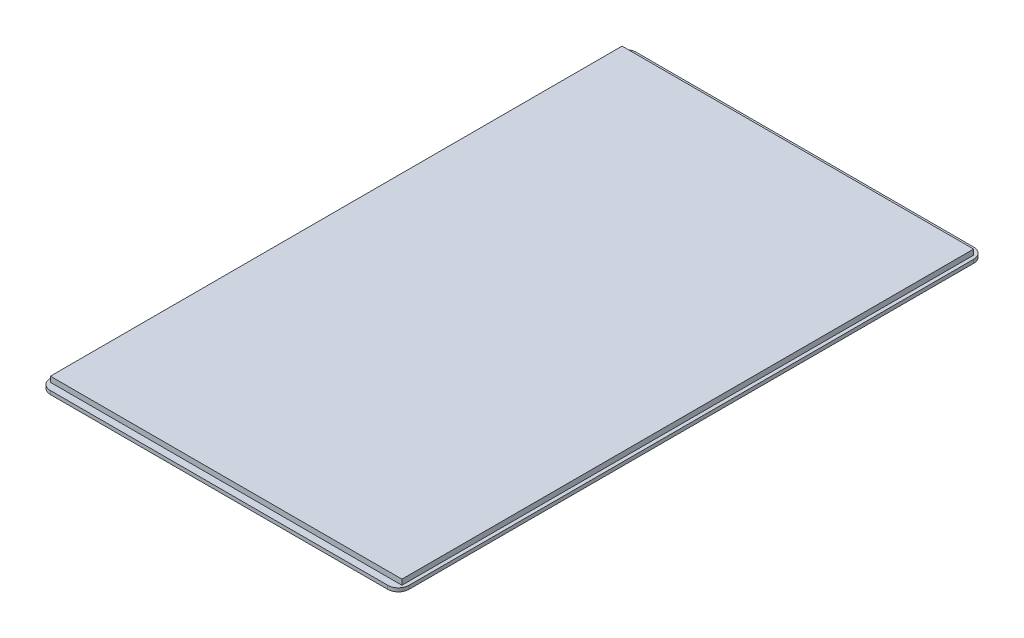
ISO-10303-21;
HEADER;
FILE_DESCRIPTION(('STEP AP214'),'2;1');
FILE_NAME('part.step','',(''),(''),'','','');
FILE_SCHEMA(('AUTOMOTIVE_DESIGN { 1 0 10303 214 1 1 1 1 }'));
ENDSEC;
DATA;
#1=APPLICATION_CONTEXT('core data for automotive mechanical design processes');
#2=APPLICATION_PROTOCOL_DEFINITION('international standard','automotive_design',2000,#1);
#3=PRODUCT_CONTEXT('',#1,'mechanical');
#4=PRODUCT('Part','Part','',(#3));
#5=PRODUCT_RELATED_PRODUCT_CATEGORY('part','',(#4));
#6=PRODUCT_DEFINITION_FORMATION('','',#4);
#7=PRODUCT_DEFINITION_CONTEXT('part definition',#1,'design');
#8=PRODUCT_DEFINITION('design','',#6,#7);
#9=PRODUCT_DEFINITION_SHAPE('','',#8);
#10=(LENGTH_UNIT() NAMED_UNIT(*) SI_UNIT(.MILLI.,.METRE.));
#11=(NAMED_UNIT(*) PLANE_ANGLE_UNIT() SI_UNIT($,.RADIAN.));
#12=(NAMED_UNIT(*) SI_UNIT($,.STERADIAN.) SOLID_ANGLE_UNIT());
#13=UNCERTAINTY_MEASURE_WITH_UNIT(LENGTH_MEASURE(1.E-05),#10,'distance_accuracy_value','');
#14=(GEOMETRIC_REPRESENTATION_CONTEXT(3) GLOBAL_UNCERTAINTY_ASSIGNED_CONTEXT((#13)) GLOBAL_UNIT_ASSIGNED_CONTEXT((#10,
#11,#12)) REPRESENTATION_CONTEXT('',''));
#15=CARTESIAN_POINT('',(0.,0.,0.));
#16=DIRECTION('',(0.,0.,1.));
#17=DIRECTION('',(1.,0.,0.));
#18=AXIS2_PLACEMENT_3D('',#15,#16,#17);
#19=CARTESIAN_POINT('',(50.5,1.,-82.5));
#20=DIRECTION('',(-1.,0.,0.));
#21=DIRECTION('',(0.,0.,1.));
#22=AXIS2_PLACEMENT_3D('',#19,#20,#21);
#23=PLANE('',#22);
#24=DIRECTION('',(0.,0.,-1.));
#25=VECTOR('',#24,1.);
#26=CARTESIAN_POINT('',(50.5,1.,-82.5));
#27=LINE('',#26,#25);
#28=CARTESIAN_POINT('',(50.5,1.,79.5));
#29=VERTEX_POINT('',#28);
#30=CARTESIAN_POINT('',(50.5,1.,-79.5));
#31=VERTEX_POINT('',#30);
#32=EDGE_CURVE('E157',#29,#31,#27,.T.);
#33=ORIENTED_EDGE('',*,*,#32,.F.);
#34=DIRECTION('',(0.,-1.,0.));
#35=VECTOR('',#34,1.);
#36=CARTESIAN_POINT('',(50.5,1.,79.5));
#37=LINE('',#36,#35);
#38=CARTESIAN_POINT('',(50.5,0.,79.5));
#39=VERTEX_POINT('',#38);
#40=EDGE_CURVE('E201',#29,#39,#37,.T.);
#41=ORIENTED_EDGE('',*,*,#40,.T.);
#42=DIRECTION('',(0.,0.,-1.));
#43=VECTOR('',#42,1.);
#44=CARTESIAN_POINT('',(50.5,0.,-82.5));
#45=LINE('',#44,#43);
#46=CARTESIAN_POINT('',(50.5,0.,-79.5));
#47=VERTEX_POINT('',#46);
#48=EDGE_CURVE('E148',#39,#47,#45,.T.);
#49=ORIENTED_EDGE('',*,*,#48,.T.);
#50=DIRECTION('',(0.,-1.,0.));
#51=VECTOR('',#50,1.);
#52=CARTESIAN_POINT('',(50.5,1.,-79.5));
#53=LINE('',#52,#51);
#54=EDGE_CURVE('E199',#47,#31,#53,.F.);
#55=ORIENTED_EDGE('',*,*,#54,.T.);
#56=EDGE_LOOP('',(#33,#41,#49,#55));
#57=FACE_BOUND('',#56,.T.);
#58=ADVANCED_FACE('F33',(#57),#23,.F.);
#59=CARTESIAN_POINT('',(-50.5,1.,-82.5));
#60=DIRECTION('',(0.,0.,1.));
#61=DIRECTION('',(1.,0.,0.));
#62=AXIS2_PLACEMENT_3D('',#59,#60,#61);
#63=PLANE('',#62);
#64=DIRECTION('',(-1.,0.,0.));
#65=VECTOR('',#64,1.);
#66=CARTESIAN_POINT('',(-50.5,1.,-82.5));
#67=LINE('',#66,#65);
#68=CARTESIAN_POINT('',(47.5,1.,-82.5));
#69=VERTEX_POINT('',#68);
#70=CARTESIAN_POINT('',(-47.5,1.,-82.5));
#71=VERTEX_POINT('',#70);
#72=EDGE_CURVE('E159',#69,#71,#67,.T.);
#73=ORIENTED_EDGE('',*,*,#72,.F.);
#74=DIRECTION('',(0.,-1.,0.));
#75=VECTOR('',#74,1.);
#76=CARTESIAN_POINT('',(47.5,1.,-82.5));
#77=LINE('',#76,#75);
#78=CARTESIAN_POINT('',(47.5,0.,-82.5));
#79=VERTEX_POINT('',#78);
#80=EDGE_CURVE('E11',#69,#79,#77,.T.);
#81=ORIENTED_EDGE('',*,*,#80,.T.);
#82=DIRECTION('',(-1.,0.,0.));
#83=VECTOR('',#82,1.);
#84=CARTESIAN_POINT('',(-50.5,0.,-82.5));
#85=LINE('',#84,#83);
#86=CARTESIAN_POINT('',(-47.5,0.,-82.5));
#87=VERTEX_POINT('',#86);
#88=EDGE_CURVE('E151',#79,#87,#85,.T.);
#89=ORIENTED_EDGE('',*,*,#88,.T.);
#90=DIRECTION('',(0.,-1.,0.));
#91=VECTOR('',#90,1.);
#92=CARTESIAN_POINT('',(-47.5,1.,-82.5));
#93=LINE('',#92,#91);
#94=EDGE_CURVE('E41',#87,#71,#93,.F.);
#95=ORIENTED_EDGE('',*,*,#94,.T.);
#96=EDGE_LOOP('',(#73,#81,#89,#95));
#97=FACE_BOUND('',#96,.T.);
#98=ADVANCED_FACE('F217',(#97),#63,.F.);
#99=CARTESIAN_POINT('',(-50.5,1.,-82.5));
#100=DIRECTION('',(1.,0.,0.));
#101=DIRECTION('',(0.,0.,-1.));
#102=AXIS2_PLACEMENT_3D('',#99,#100,#101);
#103=PLANE('',#102);
#104=DIRECTION('',(0.,0.,1.));
#105=VECTOR('',#104,1.);
#106=CARTESIAN_POINT('',(-50.5,0.,-82.5));
#107=LINE('',#106,#105);
#108=CARTESIAN_POINT('',(-50.5,0.,-79.5));
#109=VERTEX_POINT('',#108);
#110=CARTESIAN_POINT('',(-50.5,0.,79.5));
#111=VERTEX_POINT('',#110);
#112=EDGE_CURVE('E170',#109,#111,#107,.T.);
#113=ORIENTED_EDGE('',*,*,#112,.T.);
#114=DIRECTION('',(0.,-1.,0.));
#115=VECTOR('',#114,1.);
#116=CARTESIAN_POINT('',(-50.5,1.,79.5));
#117=LINE('',#116,#115);
#118=CARTESIAN_POINT('',(-50.5,1.,79.5));
#119=VERTEX_POINT('',#118);
#120=EDGE_CURVE('E190',#111,#119,#117,.F.);
#121=ORIENTED_EDGE('',*,*,#120,.T.);
#122=DIRECTION('',(0.,0.,1.));
#123=VECTOR('',#122,1.);
#124=CARTESIAN_POINT('',(-50.5,1.,-82.5));
#125=LINE('',#124,#123);
#126=CARTESIAN_POINT('',(-50.5,1.,-79.5));
#127=VERTEX_POINT('',#126);
#128=EDGE_CURVE('E162',#127,#119,#125,.T.);
#129=ORIENTED_EDGE('',*,*,#128,.F.);
#130=DIRECTION('',(0.,-1.,0.));
#131=VECTOR('',#130,1.);
#132=CARTESIAN_POINT('',(-50.5,1.,-79.5));
#133=LINE('',#132,#131);
#134=EDGE_CURVE('E187',#127,#109,#133,.T.);
#135=ORIENTED_EDGE('',*,*,#134,.T.);
#136=EDGE_LOOP('',(#113,#121,#129,#135));
#137=FACE_BOUND('',#136,.T.);
#138=ADVANCED_FACE('F225',(#137),#103,.F.);
#139=CARTESIAN_POINT('',(-50.5,1.,82.5));
#140=DIRECTION('',(0.,0.,-1.));
#141=DIRECTION('',(-1.,0.,0.));
#142=AXIS2_PLACEMENT_3D('',#139,#140,#141);
#143=PLANE('',#142);
#144=DIRECTION('',(1.,0.,0.));
#145=VECTOR('',#144,1.);
#146=CARTESIAN_POINT('',(-50.5,1.,82.5));
#147=LINE('',#146,#145);
#148=CARTESIAN_POINT('',(-47.5,1.,82.5));
#149=VERTEX_POINT('',#148);
#150=CARTESIAN_POINT('',(47.5,1.,82.5));
#151=VERTEX_POINT('',#150);
#152=EDGE_CURVE('E165',#149,#151,#147,.T.);
#153=ORIENTED_EDGE('',*,*,#152,.F.);
#154=DIRECTION('',(0.,-1.,0.));
#155=VECTOR('',#154,1.);
#156=CARTESIAN_POINT('',(-47.5,1.,82.5));
#157=LINE('',#156,#155);
#158=CARTESIAN_POINT('',(-47.5,0.,82.5));
#159=VERTEX_POINT('',#158);
#160=EDGE_CURVE('E176',#149,#159,#157,.T.);
#161=ORIENTED_EDGE('',*,*,#160,.T.);
#162=DIRECTION('',(1.,0.,0.));
#163=VECTOR('',#162,1.);
#164=CARTESIAN_POINT('',(-50.5,0.,82.5));
#165=LINE('',#164,#163);
#166=CARTESIAN_POINT('',(47.5,0.,82.5));
#167=VERTEX_POINT('',#166);
#168=EDGE_CURVE('E160',#159,#167,#165,.T.);
#169=ORIENTED_EDGE('',*,*,#168,.T.);
#170=DIRECTION('',(0.,-1.,0.));
#171=VECTOR('',#170,1.);
#172=CARTESIAN_POINT('',(47.5,1.,82.5));
#173=LINE('',#172,#171);
#174=EDGE_CURVE('E167',#167,#151,#173,.F.);
#175=ORIENTED_EDGE('',*,*,#174,.T.);
#176=EDGE_LOOP('',(#153,#161,#169,#175));
#177=FACE_BOUND('',#176,.T.);
#178=ADVANCED_FACE('F233',(#177),#143,.F.);
#179=CARTESIAN_POINT('',(0.,1.,0.));
#180=DIRECTION('',(0.,1.,0.));
#181=DIRECTION('',(0.,0.,1.));
#182=AXIS2_PLACEMENT_3D('',#179,#180,#181);
#183=PLANE('',#182);
#184=DIRECTION('',(0.,0.,-1.));
#185=VECTOR('',#184,1.);
#186=CARTESIAN_POINT('',(49.5,1.,-80.5));
#187=LINE('',#186,#185);
#188=CARTESIAN_POINT('',(49.5,1.,80.5));
#189=VERTEX_POINT('',#188);
#190=CARTESIAN_POINT('',(49.5,1.,-80.5));
#191=VERTEX_POINT('',#190);
#192=EDGE_CURVE('E147',#189,#191,#187,.T.);
#193=ORIENTED_EDGE('',*,*,#192,.F.);
#194=DIRECTION('',(1.,0.,0.));
#195=VECTOR('',#194,1.);
#196=CARTESIAN_POINT('',(-49.5,1.,80.5));
#197=LINE('',#196,#195);
#198=CARTESIAN_POINT('',(-49.5,1.,80.5));
#199=VERTEX_POINT('',#198);
#200=EDGE_CURVE('E144',#199,#189,#197,.T.);
#201=ORIENTED_EDGE('',*,*,#200,.F.);
#202=DIRECTION('',(0.,0.,1.));
#203=VECTOR('',#202,1.);
#204=CARTESIAN_POINT('',(-49.5,1.,-80.5));
#205=LINE('',#204,#203);
#206=CARTESIAN_POINT('',(-49.5,1.,-80.5));
#207=VERTEX_POINT('',#206);
#208=EDGE_CURVE('E364',#207,#199,#205,.T.);
#209=ORIENTED_EDGE('',*,*,#208,.F.);
#210=DIRECTION('',(-1.,0.,0.));
#211=VECTOR('',#210,1.);
#212=CARTESIAN_POINT('',(-49.5,1.,-80.5));
#213=LINE('',#212,#211);
#214=EDGE_CURVE('E370',#191,#207,#213,.T.);
#215=ORIENTED_EDGE('',*,*,#214,.F.);
#216=EDGE_LOOP('',(#193,#201,#209,#215));
#217=FACE_BOUND('',#216,.T.);
#218=ORIENTED_EDGE('',*,*,#128,.T.);
#219=CARTESIAN_POINT('',(-47.5,1.,79.5));
#220=DIRECTION('',(0.,1.,0.));
#221=DIRECTION('',(0.,0.,1.));
#222=AXIS2_PLACEMENT_3D('',#219,#220,#221);
#223=CIRCLE('',#222,3.);
#224=EDGE_CURVE('E197',#119,#149,#223,.T.);
#225=ORIENTED_EDGE('',*,*,#224,.T.);
#226=ORIENTED_EDGE('',*,*,#152,.T.);
#227=CARTESIAN_POINT('',(47.5,1.,79.5));
#228=DIRECTION('',(0.,1.,0.));
#229=DIRECTION('',(0.,0.,1.));
#230=AXIS2_PLACEMENT_3D('',#227,#228,#229);
#231=CIRCLE('',#230,3.);
#232=EDGE_CURVE('E195',#151,#29,#231,.T.);
#233=ORIENTED_EDGE('',*,*,#232,.T.);
#234=ORIENTED_EDGE('',*,*,#32,.T.);
#235=CARTESIAN_POINT('',(47.5,1.,-79.5));
#236=DIRECTION('',(0.,1.,0.));
#237=DIRECTION('',(0.,0.,1.));
#238=AXIS2_PLACEMENT_3D('',#235,#236,#237);
#239=CIRCLE('',#238,3.);
#240=EDGE_CURVE('E54',#31,#69,#239,.T.);
#241=ORIENTED_EDGE('',*,*,#240,.T.);
#242=ORIENTED_EDGE('',*,*,#72,.T.);
#243=CARTESIAN_POINT('',(-47.5,1.,-79.5));
#244=DIRECTION('',(0.,1.,0.));
#245=DIRECTION('',(0.,0.,1.));
#246=AXIS2_PLACEMENT_3D('',#243,#244,#245);
#247=CIRCLE('',#246,3.);
#248=EDGE_CURVE('E192',#71,#127,#247,.T.);
#249=ORIENTED_EDGE('',*,*,#248,.T.);
#250=EDGE_LOOP('',(#218,#225,#226,#233,#234,#241,#242,#249));
#251=FACE_BOUND('',#250,.T.);
#252=ADVANCED_FACE('F219',(#217,#251),#183,.T.);
#253=CARTESIAN_POINT('',(0.,0.,0.));
#254=DIRECTION('',(0.,1.,0.));
#255=DIRECTION('',(0.,0.,1.));
#256=AXIS2_PLACEMENT_3D('',#253,#254,#255);
#257=PLANE('',#256);
#258=ORIENTED_EDGE('',*,*,#168,.F.);
#259=CARTESIAN_POINT('',(-47.5,0.,79.5));
#260=DIRECTION('',(0.,1.,0.));
#261=DIRECTION('',(0.,0.,1.));
#262=AXIS2_PLACEMENT_3D('',#259,#260,#261);
#263=CIRCLE('',#262,3.);
#264=EDGE_CURVE('E185',#159,#111,#263,.F.);
#265=ORIENTED_EDGE('',*,*,#264,.T.);
#266=ORIENTED_EDGE('',*,*,#112,.F.);
#267=CARTESIAN_POINT('',(-47.5,0.,-79.5));
#268=DIRECTION('',(0.,1.,0.));
#269=DIRECTION('',(0.,0.,1.));
#270=AXIS2_PLACEMENT_3D('',#267,#268,#269);
#271=CIRCLE('',#270,3.);
#272=EDGE_CURVE('E179',#109,#87,#271,.F.);
#273=ORIENTED_EDGE('',*,*,#272,.T.);
#274=ORIENTED_EDGE('',*,*,#88,.F.);
#275=CARTESIAN_POINT('',(47.5,0.,-79.5));
#276=DIRECTION('',(0.,1.,0.));
#277=DIRECTION('',(0.,0.,1.));
#278=AXIS2_PLACEMENT_3D('',#275,#276,#277);
#279=CIRCLE('',#278,3.);
#280=EDGE_CURVE('E181',#79,#47,#279,.F.);
#281=ORIENTED_EDGE('',*,*,#280,.T.);
#282=ORIENTED_EDGE('',*,*,#48,.F.);
#283=CARTESIAN_POINT('',(47.5,0.,79.5));
#284=DIRECTION('',(0.,1.,0.));
#285=DIRECTION('',(0.,0.,1.));
#286=AXIS2_PLACEMENT_3D('',#283,#284,#285);
#287=CIRCLE('',#286,3.);
#288=EDGE_CURVE('E183',#39,#167,#287,.F.);
#289=ORIENTED_EDGE('',*,*,#288,.T.);
#290=EDGE_LOOP('',(#258,#265,#266,#273,#274,#281,#282,#289));
#291=FACE_BOUND('',#290,.T.);
#292=ADVANCED_FACE('F212',(#291),#257,.F.);
#293=CARTESIAN_POINT('',(49.5,2.5,-80.5));
#294=DIRECTION('',(-1.,0.,0.));
#295=DIRECTION('',(0.,0.,1.));
#296=AXIS2_PLACEMENT_3D('',#293,#294,#295);
#297=PLANE('',#296);
#298=ORIENTED_EDGE('',*,*,#192,.T.);
#299=DIRECTION('',(0.,-1.,0.));
#300=VECTOR('',#299,1.);
#301=CARTESIAN_POINT('',(49.5,2.5,-80.5));
#302=LINE('',#301,#300);
#303=CARTESIAN_POINT('',(49.5,2.5,-80.5));
#304=VERTEX_POINT('',#303);
#305=EDGE_CURVE('E128',#304,#191,#302,.T.);
#306=ORIENTED_EDGE('',*,*,#305,.F.);
#307=DIRECTION('',(0.,0.,-1.));
#308=VECTOR('',#307,1.);
#309=CARTESIAN_POINT('',(49.5,2.5,-80.5));
#310=LINE('',#309,#308);
#311=CARTESIAN_POINT('',(49.5,2.5,80.5));
#312=VERTEX_POINT('',#311);
#313=EDGE_CURVE('E135',#312,#304,#310,.T.);
#314=ORIENTED_EDGE('',*,*,#313,.F.);
#315=DIRECTION('',(0.,-1.,0.));
#316=VECTOR('',#315,1.);
#317=CARTESIAN_POINT('',(49.5,2.5,80.5));
#318=LINE('',#317,#316);
#319=EDGE_CURVE('E361',#312,#189,#318,.T.);
#320=ORIENTED_EDGE('',*,*,#319,.T.);
#321=EDGE_LOOP('',(#298,#306,#314,#320));
#322=FACE_BOUND('',#321,.T.);
#323=ADVANCED_FACE('F146',(#322),#297,.F.);
#324=CARTESIAN_POINT('',(-49.5,2.5,-80.5));
#325=DIRECTION('',(0.,0.,1.));
#326=DIRECTION('',(1.,0.,0.));
#327=AXIS2_PLACEMENT_3D('',#324,#325,#326);
#328=PLANE('',#327);
#329=ORIENTED_EDGE('',*,*,#214,.T.);
#330=DIRECTION('',(0.,-1.,0.));
#331=VECTOR('',#330,1.);
#332=CARTESIAN_POINT('',(-49.5,2.5,-80.5));
#333=LINE('',#332,#331);
#334=CARTESIAN_POINT('',(-49.5,2.5,-80.5));
#335=VERTEX_POINT('',#334);
#336=EDGE_CURVE('E131',#335,#207,#333,.T.);
#337=ORIENTED_EDGE('',*,*,#336,.F.);
#338=DIRECTION('',(-1.,0.,0.));
#339=VECTOR('',#338,1.);
#340=CARTESIAN_POINT('',(-49.5,2.5,-80.5));
#341=LINE('',#340,#339);
#342=EDGE_CURVE('E123',#304,#335,#341,.T.);
#343=ORIENTED_EDGE('',*,*,#342,.F.);
#344=ORIENTED_EDGE('',*,*,#305,.T.);
#345=EDGE_LOOP('',(#329,#337,#343,#344));
#346=FACE_BOUND('',#345,.T.);
#347=ADVANCED_FACE('F126',(#346),#328,.F.);
#348=CARTESIAN_POINT('',(-49.5,2.5,-80.5));
#349=DIRECTION('',(1.,0.,0.));
#350=DIRECTION('',(0.,0.,-1.));
#351=AXIS2_PLACEMENT_3D('',#348,#349,#350);
#352=PLANE('',#351);
#353=ORIENTED_EDGE('',*,*,#208,.T.);
#354=DIRECTION('',(0.,-1.,0.));
#355=VECTOR('',#354,1.);
#356=CARTESIAN_POINT('',(-49.5,2.5,80.5));
#357=LINE('',#356,#355);
#358=CARTESIAN_POINT('',(-49.5,2.5,80.5));
#359=VERTEX_POINT('',#358);
#360=EDGE_CURVE('E153',#359,#199,#357,.T.);
#361=ORIENTED_EDGE('',*,*,#360,.F.);
#362=DIRECTION('',(0.,0.,1.));
#363=VECTOR('',#362,1.);
#364=CARTESIAN_POINT('',(-49.5,2.5,-80.5));
#365=LINE('',#364,#363);
#366=EDGE_CURVE('E134',#335,#359,#365,.T.);
#367=ORIENTED_EDGE('',*,*,#366,.F.);
#368=ORIENTED_EDGE('',*,*,#336,.T.);
#369=EDGE_LOOP('',(#353,#361,#367,#368));
#370=FACE_BOUND('',#369,.T.);
#371=ADVANCED_FACE('F264',(#370),#352,.F.);
#372=CARTESIAN_POINT('',(-49.5,2.5,80.5));
#373=DIRECTION('',(0.,0.,-1.));
#374=DIRECTION('',(-1.,0.,0.));
#375=AXIS2_PLACEMENT_3D('',#372,#373,#374);
#376=PLANE('',#375);
#377=ORIENTED_EDGE('',*,*,#200,.T.);
#378=ORIENTED_EDGE('',*,*,#319,.F.);
#379=DIRECTION('',(1.,0.,0.));
#380=VECTOR('',#379,1.);
#381=CARTESIAN_POINT('',(-49.5,2.5,80.5));
#382=LINE('',#381,#380);
#383=EDGE_CURVE('E140',#359,#312,#382,.T.);
#384=ORIENTED_EDGE('',*,*,#383,.F.);
#385=ORIENTED_EDGE('',*,*,#360,.T.);
#386=EDGE_LOOP('',(#377,#378,#384,#385));
#387=FACE_BOUND('',#386,.T.);
#388=ADVANCED_FACE('F267',(#387),#376,.F.);
#389=CARTESIAN_POINT('',(0.,2.5,0.));
#390=DIRECTION('',(0.,1.,0.));
#391=DIRECTION('',(0.,0.,1.));
#392=AXIS2_PLACEMENT_3D('',#389,#390,#391);
#393=PLANE('',#392);
#394=ORIENTED_EDGE('',*,*,#313,.T.);
#395=ORIENTED_EDGE('',*,*,#342,.T.);
#396=ORIENTED_EDGE('',*,*,#366,.T.);
#397=ORIENTED_EDGE('',*,*,#383,.T.);
#398=EDGE_LOOP('',(#394,#395,#396,#397));
#399=FACE_BOUND('',#398,.T.);
#400=ADVANCED_FACE('F138',(#399),#393,.T.);
#401=CARTESIAN_POINT('',(-47.5,1.,79.5));
#402=DIRECTION('',(0.,-1.,0.));
#403=DIRECTION('',(0.,0.,-1.));
#404=AXIS2_PLACEMENT_3D('',#401,#402,#403);
#405=CYLINDRICAL_SURFACE('',#404,3.);
#406=ORIENTED_EDGE('',*,*,#224,.F.);
#407=ORIENTED_EDGE('',*,*,#120,.F.);
#408=ORIENTED_EDGE('',*,*,#264,.F.);
#409=ORIENTED_EDGE('',*,*,#160,.F.);
#410=EDGE_LOOP('',(#406,#407,#408,#409));
#411=FACE_BOUND('',#410,.T.);
#412=ADVANCED_FACE('F230',(#411),#405,.T.);
#413=CARTESIAN_POINT('',(47.5,1.,79.5));
#414=DIRECTION('',(0.,-1.,0.));
#415=DIRECTION('',(0.,0.,-1.));
#416=AXIS2_PLACEMENT_3D('',#413,#414,#415);
#417=CYLINDRICAL_SURFACE('',#416,3.);
#418=ORIENTED_EDGE('',*,*,#232,.F.);
#419=ORIENTED_EDGE('',*,*,#174,.F.);
#420=ORIENTED_EDGE('',*,*,#288,.F.);
#421=ORIENTED_EDGE('',*,*,#40,.F.);
#422=EDGE_LOOP('',(#418,#419,#420,#421));
#423=FACE_BOUND('',#422,.T.);
#424=ADVANCED_FACE('F235',(#423),#417,.T.);
#425=CARTESIAN_POINT('',(47.5,1.,-79.5));
#426=DIRECTION('',(0.,-1.,0.));
#427=DIRECTION('',(0.,0.,-1.));
#428=AXIS2_PLACEMENT_3D('',#425,#426,#427);
#429=CYLINDRICAL_SURFACE('',#428,3.);
#430=ORIENTED_EDGE('',*,*,#240,.F.);
#431=ORIENTED_EDGE('',*,*,#54,.F.);
#432=ORIENTED_EDGE('',*,*,#280,.F.);
#433=ORIENTED_EDGE('',*,*,#80,.F.);
#434=EDGE_LOOP('',(#430,#431,#432,#433));
#435=FACE_BOUND('',#434,.T.);
#436=ADVANCED_FACE('F216',(#435),#429,.T.);
#437=CARTESIAN_POINT('',(-47.5,1.,-79.5));
#438=DIRECTION('',(0.,-1.,0.));
#439=DIRECTION('',(0.,0.,-1.));
#440=AXIS2_PLACEMENT_3D('',#437,#438,#439);
#441=CYLINDRICAL_SURFACE('',#440,3.);
#442=ORIENTED_EDGE('',*,*,#248,.F.);
#443=ORIENTED_EDGE('',*,*,#94,.F.);
#444=ORIENTED_EDGE('',*,*,#272,.F.);
#445=ORIENTED_EDGE('',*,*,#134,.F.);
#446=EDGE_LOOP('',(#442,#443,#444,#445));
#447=FACE_BOUND('',#446,.T.);
#448=ADVANCED_FACE('F35',(#447),#441,.T.);
#449=CLOSED_SHELL('',(#58,#98,#138,#178,#252,#292,#323,#347,#371,#388,#400,#412,#424,#436,#448));
#450=MANIFOLD_SOLID_BREP('B2',#449);
#451=ADVANCED_BREP_SHAPE_REPRESENTATION('',(#18,#450),#14);
#452=SHAPE_DEFINITION_REPRESENTATION(#9,#451);
ENDSEC;
END-ISO-10303-21;
